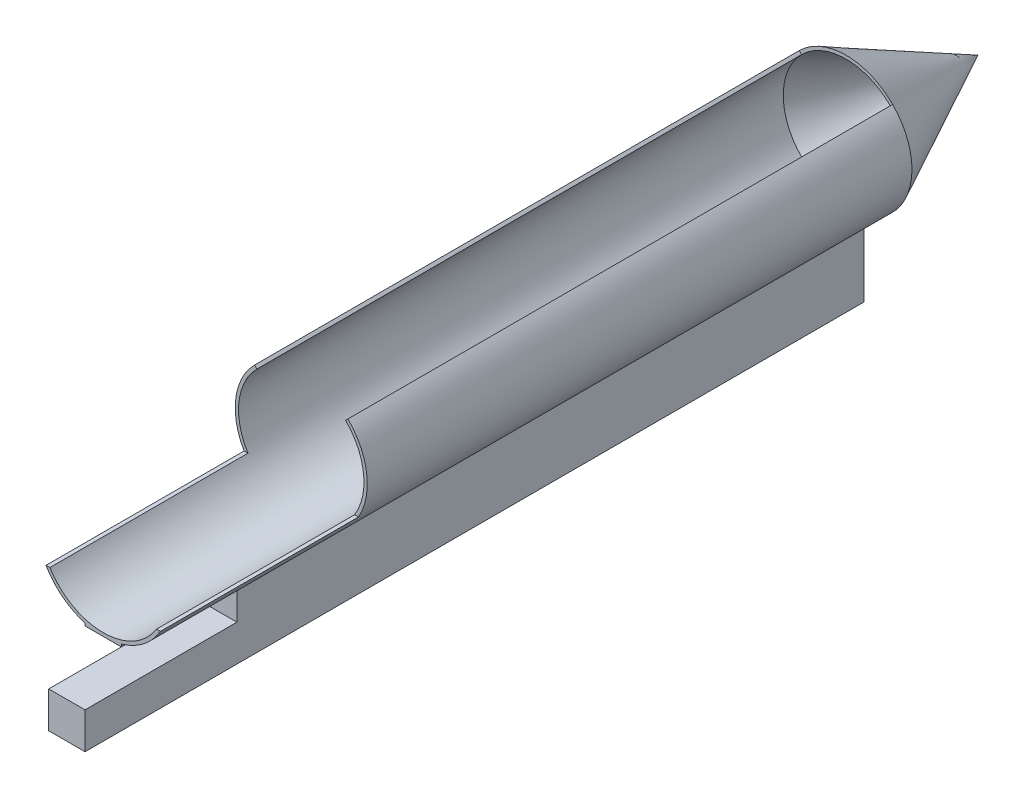
ISO-10303-21;
HEADER;
FILE_DESCRIPTION(('STEP AP214'),'2;1');
FILE_NAME('part.step','',(''),(''),'','','');
FILE_SCHEMA(('AUTOMOTIVE_DESIGN { 1 0 10303 214 1 1 1 1 }'));
ENDSEC;
DATA;
#1=APPLICATION_CONTEXT('core data for automotive mechanical design processes');
#2=APPLICATION_PROTOCOL_DEFINITION('international standard','automotive_design',2000,#1);
#3=PRODUCT_CONTEXT('',#1,'mechanical');
#4=PRODUCT('Part','Part','',(#3));
#5=PRODUCT_RELATED_PRODUCT_CATEGORY('part','',(#4));
#6=PRODUCT_DEFINITION_FORMATION('','',#4);
#7=PRODUCT_DEFINITION_CONTEXT('part definition',#1,'design');
#8=PRODUCT_DEFINITION('design','',#6,#7);
#9=PRODUCT_DEFINITION_SHAPE('','',#8);
#10=(LENGTH_UNIT() NAMED_UNIT(*) SI_UNIT(.MILLI.,.METRE.));
#11=(NAMED_UNIT(*) PLANE_ANGLE_UNIT() SI_UNIT($,.RADIAN.));
#12=(NAMED_UNIT(*) SI_UNIT($,.STERADIAN.) SOLID_ANGLE_UNIT());
#13=UNCERTAINTY_MEASURE_WITH_UNIT(LENGTH_MEASURE(1.E-05),#10,'distance_accuracy_value','');
#14=(GEOMETRIC_REPRESENTATION_CONTEXT(3) GLOBAL_UNCERTAINTY_ASSIGNED_CONTEXT((#13)) GLOBAL_UNIT_ASSIGNED_CONTEXT((#10,
#11,#12)) REPRESENTATION_CONTEXT('',''));
#15=CARTESIAN_POINT('',(0.,0.,0.));
#16=DIRECTION('',(0.,0.,1.));
#17=DIRECTION('',(1.,0.,0.));
#18=AXIS2_PLACEMENT_3D('',#15,#16,#17);
#19=CARTESIAN_POINT('',(0.,0.,0.));
#20=DIRECTION('',(0.,0.,1.));
#21=DIRECTION('',(1.,0.,0.));
#22=AXIS2_PLACEMENT_3D('',#19,#20,#21);
#23=PLANE('',#22);
#24=CARTESIAN_POINT('',(0.,0.,0.));
#25=DIRECTION('',(0.,0.,1.));
#26=DIRECTION('',(1.,0.,0.));
#27=AXIS2_PLACEMENT_3D('',#24,#25,#26);
#28=CIRCLE('',#27,40.);
#29=CARTESIAN_POINT('',(11.,-38.4577690460588,0.));
#30=VERTEX_POINT('',#29);
#31=CARTESIAN_POINT('',(-11.,-38.4577690460588,0.));
#32=VERTEX_POINT('',#31);
#33=EDGE_CURVE('E11',#30,#32,#28,.F.);
#34=ORIENTED_EDGE('',*,*,#33,.F.);
#35=DIRECTION('',(0.,1.,0.));
#36=VECTOR('',#35,1.);
#37=CARTESIAN_POINT('',(11.,-38.4577690460588,0.));
#38=LINE('',#37,#36);
#39=CARTESIAN_POINT('',(11.,-84.,0.));
#40=VERTEX_POINT('',#39);
#41=EDGE_CURVE('E269',#40,#30,#38,.T.);
#42=ORIENTED_EDGE('',*,*,#41,.F.);
#43=DIRECTION('',(1.,0.,0.));
#44=VECTOR('',#43,1.);
#45=CARTESIAN_POINT('',(-11.,-84.,0.));
#46=LINE('',#45,#44);
#47=CARTESIAN_POINT('',(-11.,-84.,0.));
#48=VERTEX_POINT('',#47);
#49=EDGE_CURVE('E288',#48,#40,#46,.T.);
#50=ORIENTED_EDGE('',*,*,#49,.F.);
#51=DIRECTION('',(0.,-1.,0.));
#52=VECTOR('',#51,1.);
#53=CARTESIAN_POINT('',(-11.,-38.4577690460588,0.));
#54=LINE('',#53,#52);
#55=EDGE_CURVE('E286',#32,#48,#54,.T.);
#56=ORIENTED_EDGE('',*,*,#55,.F.);
#57=EDGE_LOOP('',(#34,#42,#50,#56));
#58=FACE_BOUND('',#57,.T.);
#59=ADVANCED_FACE('F33',(#58),#23,.F.);
#60=CARTESIAN_POINT('',(0.,0.,472.));
#61=DIRECTION('',(0.,0.,-1.));
#62=DIRECTION('',(-1.,0.,0.));
#63=AXIS2_PLACEMENT_3D('',#60,#61,#62);
#64=CYLINDRICAL_SURFACE('',#63,40.);
#65=CARTESIAN_POINT('',(0.,0.,330.));
#66=DIRECTION('',(0.,0.,-1.));
#67=DIRECTION('',(-1.,0.,0.));
#68=AXIS2_PLACEMENT_3D('',#65,#66,#67);
#69=CIRCLE('',#68,40.);
#70=CARTESIAN_POINT('',(28.2842712474617,28.2842712474621,330.));
#71=VERTEX_POINT('',#70);
#72=CARTESIAN_POINT('',(34.6410161513775,-20.,330.));
#73=VERTEX_POINT('',#72);
#74=EDGE_CURVE('E326',#71,#73,#69,.T.);
#75=ORIENTED_EDGE('',*,*,#74,.T.);
#76=DIRECTION('',(0.,0.,-1.));
#77=VECTOR('',#76,1.);
#78=CARTESIAN_POINT('',(34.6410161513775,-20.,472.));
#79=LINE('',#78,#77);
#80=CARTESIAN_POINT('',(34.6410161513775,-20.,450.));
#81=VERTEX_POINT('',#80);
#82=EDGE_CURVE('E250',#73,#81,#79,.F.);
#83=ORIENTED_EDGE('',*,*,#82,.T.);
#84=CARTESIAN_POINT('',(0.,0.,450.));
#85=DIRECTION('',(0.,0.,1.));
#86=DIRECTION('',(1.,0.,0.));
#87=AXIS2_PLACEMENT_3D('',#84,#85,#86);
#88=CIRCLE('',#87,40.);
#89=CARTESIAN_POINT('',(11.,-38.4577690460588,450.));
#90=VERTEX_POINT('',#89);
#91=EDGE_CURVE('E255',#90,#81,#88,.T.);
#92=ORIENTED_EDGE('',*,*,#91,.F.);
#93=DIRECTION('',(0.,0.,-1.));
#94=VECTOR('',#93,1.);
#95=CARTESIAN_POINT('',(11.,-38.4577690460588,472.));
#96=LINE('',#95,#94);
#97=EDGE_CURVE('E274',#90,#30,#96,.T.);
#98=ORIENTED_EDGE('',*,*,#97,.T.);
#99=CARTESIAN_POINT('',(0.,0.,0.));
#100=DIRECTION('',(0.,0.,1.));
#101=DIRECTION('',(1.,0.,0.));
#102=AXIS2_PLACEMENT_3D('',#99,#100,#101);
#103=CIRCLE('',#102,40.);
#104=CARTESIAN_POINT('',(28.2842712474617,28.2842712474621,0.));
#105=VERTEX_POINT('',#104);
#106=EDGE_CURVE('E265',#30,#105,#103,.T.);
#107=ORIENTED_EDGE('',*,*,#106,.T.);
#108=DIRECTION('',(0.,0.,-1.));
#109=VECTOR('',#108,1.);
#110=CARTESIAN_POINT('',(28.2842712474617,28.2842712474621,472.));
#111=LINE('',#110,#109);
#112=EDGE_CURVE('E219',#71,#105,#111,.T.);
#113=ORIENTED_EDGE('',*,*,#112,.F.);
#114=EDGE_LOOP('',(#75,#83,#92,#98,#107,#113));
#115=FACE_BOUND('',#114,.T.);
#116=ADVANCED_FACE('F35',(#115),#64,.T.);
#117=CARTESIAN_POINT('',(26.8700576850887,26.870057685089,472.));
#118=DIRECTION('',(0.707106781186552,-0.707106781186543,0.));
#119=DIRECTION('',(0.707106781186543,0.707106781186552,0.));
#120=AXIS2_PLACEMENT_3D('',#117,#118,#119);
#121=PLANE('',#120);
#122=DIRECTION('',(0.,0.,-1.));
#123=VECTOR('',#122,1.);
#124=CARTESIAN_POINT('',(26.8700576850887,26.8700576850889,472.));
#125=LINE('',#124,#123);
#126=CARTESIAN_POINT('',(26.8700576850887,26.8700576850889,330.));
#127=VERTEX_POINT('',#126);
#128=CARTESIAN_POINT('',(26.8700576850887,26.8700576850889,0.));
#129=VERTEX_POINT('',#128);
#130=EDGE_CURVE('E212',#127,#129,#125,.T.);
#131=ORIENTED_EDGE('',*,*,#130,.F.);
#132=DIRECTION('',(0.707106781186543,0.707106781186552,0.));
#133=VECTOR('',#132,1.);
#134=CARTESIAN_POINT('',(26.8700576850887,26.870057685089,330.));
#135=LINE('',#134,#133);
#136=EDGE_CURVE('E214',#127,#71,#135,.T.);
#137=ORIENTED_EDGE('',*,*,#136,.T.);
#138=ORIENTED_EDGE('',*,*,#112,.T.);
#139=DIRECTION('',(-0.707106781186543,-0.707106781186552,0.));
#140=VECTOR('',#139,1.);
#141=CARTESIAN_POINT('',(26.8700576850887,26.870057685089,0.));
#142=LINE('',#141,#140);
#143=EDGE_CURVE('E216',#105,#129,#142,.T.);
#144=ORIENTED_EDGE('',*,*,#143,.T.);
#145=EDGE_LOOP('',(#131,#137,#138,#144));
#146=FACE_BOUND('',#145,.T.);
#147=ADVANCED_FACE('F174',(#146),#121,.F.);
#148=CARTESIAN_POINT('',(0.,0.,472.));
#149=DIRECTION('',(0.,0.,-1.));
#150=DIRECTION('',(-1.,0.,0.));
#151=AXIS2_PLACEMENT_3D('',#148,#149,#150);
#152=CYLINDRICAL_SURFACE('',#151,38.);
#153=CARTESIAN_POINT('',(0.,0.,450.));
#154=DIRECTION('',(0.,0.,1.));
#155=DIRECTION('',(1.,0.,0.));
#156=AXIS2_PLACEMENT_3D('',#153,#154,#155);
#157=CIRCLE('',#156,38.);
#158=CARTESIAN_POINT('',(32.310988842807,-20.,450.));
#159=VERTEX_POINT('',#158);
#160=CARTESIAN_POINT('',(-32.310988842807,-20.,450.));
#161=VERTEX_POINT('',#160);
#162=EDGE_CURVE('E247',#159,#161,#157,.F.);
#163=ORIENTED_EDGE('',*,*,#162,.F.);
#164=DIRECTION('',(0.,0.,-1.));
#165=VECTOR('',#164,1.);
#166=CARTESIAN_POINT('',(32.310988842807,-20.,472.));
#167=LINE('',#166,#165);
#168=CARTESIAN_POINT('',(32.310988842807,-20.,330.));
#169=VERTEX_POINT('',#168);
#170=EDGE_CURVE('E56',#159,#169,#167,.T.);
#171=ORIENTED_EDGE('',*,*,#170,.T.);
#172=CARTESIAN_POINT('',(0.,0.,330.));
#173=DIRECTION('',(0.,0.,-1.));
#174=DIRECTION('',(-1.,0.,0.));
#175=AXIS2_PLACEMENT_3D('',#172,#173,#174);
#176=CIRCLE('',#175,38.);
#177=EDGE_CURVE('E324',#169,#127,#176,.F.);
#178=ORIENTED_EDGE('',*,*,#177,.T.);
#179=ORIENTED_EDGE('',*,*,#130,.T.);
#180=CARTESIAN_POINT('',(0.,0.,0.));
#181=DIRECTION('',(0.,0.,-1.));
#182=DIRECTION('',(1.,0.,0.));
#183=AXIS2_PLACEMENT_3D('',#180,#181,#182);
#184=CIRCLE('',#183,38.);
#185=CARTESIAN_POINT('',(-26.8700576850891,26.8700576850886,0.));
#186=VERTEX_POINT('',#185);
#187=EDGE_CURVE('E278',#129,#186,#184,.T.);
#188=ORIENTED_EDGE('',*,*,#187,.T.);
#189=DIRECTION('',(0.,0.,-1.));
#190=VECTOR('',#189,1.);
#191=CARTESIAN_POINT('',(-26.8700576850891,26.8700576850886,472.));
#192=LINE('',#191,#190);
#193=CARTESIAN_POINT('',(-26.8700576850891,26.8700576850886,330.));
#194=VERTEX_POINT('',#193);
#195=EDGE_CURVE('E220',#194,#186,#192,.T.);
#196=ORIENTED_EDGE('',*,*,#195,.F.);
#197=CARTESIAN_POINT('',(-32.310988842807,-20.,330.));
#198=VERTEX_POINT('',#197);
#199=EDGE_CURVE('E249',#194,#198,#176,.F.);
#200=ORIENTED_EDGE('',*,*,#199,.T.);
#201=DIRECTION('',(0.,0.,-1.));
#202=VECTOR('',#201,1.);
#203=CARTESIAN_POINT('',(-32.310988842807,-20.,472.));
#204=LINE('',#203,#202);
#205=EDGE_CURVE('E240',#198,#161,#204,.F.);
#206=ORIENTED_EDGE('',*,*,#205,.T.);
#207=EDGE_LOOP('',(#163,#171,#178,#179,#188,#196,#200,#206));
#208=FACE_BOUND('',#207,.T.);
#209=ADVANCED_FACE('F200',(#208),#152,.F.);
#210=CARTESIAN_POINT('',(-28.2842712474622,28.2842712474616,472.));
#211=DIRECTION('',(-0.707106781186541,-0.707106781186553,0.));
#212=DIRECTION('',(0.707106781186554,-0.707106781186541,0.));
#213=AXIS2_PLACEMENT_3D('',#210,#211,#212);
#214=PLANE('',#213);
#215=DIRECTION('',(0.,0.,-1.));
#216=VECTOR('',#215,1.);
#217=CARTESIAN_POINT('',(-28.2842712474622,28.2842712474616,472.));
#218=LINE('',#217,#216);
#219=CARTESIAN_POINT('',(-28.2842712474622,28.2842712474616,330.));
#220=VERTEX_POINT('',#219);
#221=CARTESIAN_POINT('',(-28.2842712474622,28.2842712474616,0.));
#222=VERTEX_POINT('',#221);
#223=EDGE_CURVE('E225',#220,#222,#218,.T.);
#224=ORIENTED_EDGE('',*,*,#223,.F.);
#225=DIRECTION('',(0.707106781186554,-0.707106781186541,0.));
#226=VECTOR('',#225,1.);
#227=CARTESIAN_POINT('',(-28.2842712474622,28.2842712474616,330.));
#228=LINE('',#227,#226);
#229=EDGE_CURVE('E321',#220,#194,#228,.T.);
#230=ORIENTED_EDGE('',*,*,#229,.T.);
#231=ORIENTED_EDGE('',*,*,#195,.T.);
#232=DIRECTION('',(-0.707106781186554,0.707106781186542,0.));
#233=VECTOR('',#232,1.);
#234=CARTESIAN_POINT('',(-28.2842712474622,28.2842712474616,0.));
#235=LINE('',#234,#233);
#236=EDGE_CURVE('E280',#186,#222,#235,.T.);
#237=ORIENTED_EDGE('',*,*,#236,.T.);
#238=EDGE_LOOP('',(#224,#230,#231,#237));
#239=FACE_BOUND('',#238,.T.);
#240=ADVANCED_FACE('F196',(#239),#214,.F.);
#241=CARTESIAN_POINT('',(0.,0.,472.));
#242=DIRECTION('',(0.,0.,-1.));
#243=DIRECTION('',(-1.,0.,0.));
#244=AXIS2_PLACEMENT_3D('',#241,#242,#243);
#245=CYLINDRICAL_SURFACE('',#244,40.);
#246=CARTESIAN_POINT('',(0.,0.,450.));
#247=DIRECTION('',(0.,0.,1.));
#248=DIRECTION('',(1.,0.,0.));
#249=AXIS2_PLACEMENT_3D('',#246,#247,#248);
#250=CIRCLE('',#249,40.);
#251=CARTESIAN_POINT('',(-34.6410161513775,-20.,450.));
#252=VERTEX_POINT('',#251);
#253=CARTESIAN_POINT('',(-11.,-38.4577690460588,450.));
#254=VERTEX_POINT('',#253);
#255=EDGE_CURVE('E254',#252,#254,#250,.T.);
#256=ORIENTED_EDGE('',*,*,#255,.F.);
#257=DIRECTION('',(0.,0.,-1.));
#258=VECTOR('',#257,1.);
#259=CARTESIAN_POINT('',(-34.6410161513775,-20.,472.));
#260=LINE('',#259,#258);
#261=CARTESIAN_POINT('',(-34.6410161513775,-20.,330.));
#262=VERTEX_POINT('',#261);
#263=EDGE_CURVE('E48',#252,#262,#260,.T.);
#264=ORIENTED_EDGE('',*,*,#263,.T.);
#265=CARTESIAN_POINT('',(0.,0.,330.));
#266=DIRECTION('',(0.,0.,-1.));
#267=DIRECTION('',(-1.,0.,0.));
#268=AXIS2_PLACEMENT_3D('',#265,#266,#267);
#269=CIRCLE('',#268,40.);
#270=EDGE_CURVE('E41',#262,#220,#269,.T.);
#271=ORIENTED_EDGE('',*,*,#270,.T.);
#272=ORIENTED_EDGE('',*,*,#223,.T.);
#273=CARTESIAN_POINT('',(0.,0.,0.));
#274=DIRECTION('',(0.,0.,1.));
#275=DIRECTION('',(1.,0.,0.));
#276=AXIS2_PLACEMENT_3D('',#273,#274,#275);
#277=CIRCLE('',#276,40.);
#278=EDGE_CURVE('E283',#222,#32,#277,.T.);
#279=ORIENTED_EDGE('',*,*,#278,.T.);
#280=DIRECTION('',(0.,0.,-1.));
#281=VECTOR('',#280,1.);
#282=CARTESIAN_POINT('',(-11.,-38.4577690460588,472.));
#283=LINE('',#282,#281);
#284=EDGE_CURVE('E300',#254,#32,#283,.T.);
#285=ORIENTED_EDGE('',*,*,#284,.F.);
#286=EDGE_LOOP('',(#256,#264,#271,#272,#279,#285));
#287=FACE_BOUND('',#286,.T.);
#288=ADVANCED_FACE('F192',(#287),#245,.T.);
#289=CARTESIAN_POINT('',(-11.,-38.4577690460588,472.));
#290=DIRECTION('',(1.,0.,0.));
#291=DIRECTION('',(0.,1.,0.));
#292=AXIS2_PLACEMENT_3D('',#289,#290,#291);
#293=PLANE('',#292);
#294=DIRECTION('',(0.,-1.,0.));
#295=VECTOR('',#294,1.);
#296=CARTESIAN_POINT('',(-11.,-38.4577690460588,380.));
#297=LINE('',#296,#295);
#298=CARTESIAN_POINT('',(-11.,-40.,380.));
#299=VERTEX_POINT('',#298);
#300=CARTESIAN_POINT('',(-11.,-62.,380.));
#301=VERTEX_POINT('',#300);
#302=EDGE_CURVE('E343',#299,#301,#297,.T.);
#303=ORIENTED_EDGE('',*,*,#302,.F.);
#304=DIRECTION('',(0.,0.,1.));
#305=VECTOR('',#304,1.);
#306=CARTESIAN_POINT('',(-11.,-40.,472.));
#307=LINE('',#306,#305);
#308=CARTESIAN_POINT('',(-11.,-40.,450.));
#309=VERTEX_POINT('',#308);
#310=EDGE_CURVE('E340',#299,#309,#307,.T.);
#311=ORIENTED_EDGE('',*,*,#310,.T.);
#312=DIRECTION('',(0.,-1.,0.));
#313=VECTOR('',#312,1.);
#314=CARTESIAN_POINT('',(-11.,-38.4577690460588,450.));
#315=LINE('',#314,#313);
#316=EDGE_CURVE('E257',#254,#309,#315,.T.);
#317=ORIENTED_EDGE('',*,*,#316,.F.);
#318=ORIENTED_EDGE('',*,*,#284,.T.);
#319=ORIENTED_EDGE('',*,*,#55,.T.);
#320=DIRECTION('',(0.,0.,-1.));
#321=VECTOR('',#320,1.);
#322=CARTESIAN_POINT('',(-11.,-84.,472.));
#323=LINE('',#322,#321);
#324=CARTESIAN_POINT('',(-11.,-84.,472.));
#325=VERTEX_POINT('',#324);
#326=EDGE_CURVE('E297',#325,#48,#323,.T.);
#327=ORIENTED_EDGE('',*,*,#326,.F.);
#328=DIRECTION('',(0.,-1.,0.));
#329=VECTOR('',#328,1.);
#330=CARTESIAN_POINT('',(-11.,-38.4577690460588,472.));
#331=LINE('',#330,#329);
#332=CARTESIAN_POINT('',(-11.,-62.,472.));
#333=VERTEX_POINT('',#332);
#334=EDGE_CURVE('E266',#333,#325,#331,.T.);
#335=ORIENTED_EDGE('',*,*,#334,.F.);
#336=DIRECTION('',(0.,0.,-1.));
#337=VECTOR('',#336,1.);
#338=CARTESIAN_POINT('',(-11.,-62.,472.));
#339=LINE('',#338,#337);
#340=EDGE_CURVE('E259',#333,#301,#339,.T.);
#341=ORIENTED_EDGE('',*,*,#340,.T.);
#342=EDGE_LOOP('',(#303,#311,#317,#318,#319,#327,#335,#341));
#343=FACE_BOUND('',#342,.T.);
#344=ADVANCED_FACE('F188',(#343),#293,.F.);
#345=CARTESIAN_POINT('',(-11.,-84.,472.));
#346=DIRECTION('',(0.,1.,0.));
#347=DIRECTION('',(0.,0.,1.));
#348=AXIS2_PLACEMENT_3D('',#345,#346,#347);
#349=PLANE('',#348);
#350=ORIENTED_EDGE('',*,*,#49,.T.);
#351=DIRECTION('',(0.,0.,-1.));
#352=VECTOR('',#351,1.);
#353=CARTESIAN_POINT('',(11.,-84.,472.));
#354=LINE('',#353,#352);
#355=CARTESIAN_POINT('',(11.,-84.,472.));
#356=VERTEX_POINT('',#355);
#357=EDGE_CURVE('E294',#356,#40,#354,.T.);
#358=ORIENTED_EDGE('',*,*,#357,.F.);
#359=DIRECTION('',(1.,0.,0.));
#360=VECTOR('',#359,1.);
#361=CARTESIAN_POINT('',(-11.,-84.,472.));
#362=LINE('',#361,#360);
#363=EDGE_CURVE('E268',#325,#356,#362,.T.);
#364=ORIENTED_EDGE('',*,*,#363,.F.);
#365=ORIENTED_EDGE('',*,*,#326,.T.);
#366=EDGE_LOOP('',(#350,#358,#364,#365));
#367=FACE_BOUND('',#366,.T.);
#368=ADVANCED_FACE('F184',(#367),#349,.F.);
#369=CARTESIAN_POINT('',(11.,-38.4577690460588,472.));
#370=DIRECTION('',(-1.,0.,0.));
#371=DIRECTION('',(0.,-1.,0.));
#372=AXIS2_PLACEMENT_3D('',#369,#370,#371);
#373=PLANE('',#372);
#374=DIRECTION('',(0.,1.,0.));
#375=VECTOR('',#374,1.);
#376=CARTESIAN_POINT('',(11.,-38.4577690460588,450.));
#377=LINE('',#376,#375);
#378=CARTESIAN_POINT('',(11.,-40.,450.));
#379=VERTEX_POINT('',#378);
#380=EDGE_CURVE('E230',#379,#90,#377,.T.);
#381=ORIENTED_EDGE('',*,*,#380,.F.);
#382=DIRECTION('',(0.,0.,-1.));
#383=VECTOR('',#382,1.);
#384=CARTESIAN_POINT('',(11.,-40.,472.));
#385=LINE('',#384,#383);
#386=CARTESIAN_POINT('',(11.,-40.,380.));
#387=VERTEX_POINT('',#386);
#388=EDGE_CURVE('E336',#379,#387,#385,.T.);
#389=ORIENTED_EDGE('',*,*,#388,.T.);
#390=DIRECTION('',(0.,1.,0.));
#391=VECTOR('',#390,1.);
#392=CARTESIAN_POINT('',(11.,-38.4577690460588,380.));
#393=LINE('',#392,#391);
#394=CARTESIAN_POINT('',(11.,-62.,380.));
#395=VERTEX_POINT('',#394);
#396=EDGE_CURVE('E232',#395,#387,#393,.T.);
#397=ORIENTED_EDGE('',*,*,#396,.F.);
#398=DIRECTION('',(0.,0.,1.));
#399=VECTOR('',#398,1.);
#400=CARTESIAN_POINT('',(11.,-62.,472.));
#401=LINE('',#400,#399);
#402=CARTESIAN_POINT('',(11.,-62.,472.));
#403=VERTEX_POINT('',#402);
#404=EDGE_CURVE('E346',#395,#403,#401,.T.);
#405=ORIENTED_EDGE('',*,*,#404,.T.);
#406=DIRECTION('',(0.,1.,0.));
#407=VECTOR('',#406,1.);
#408=CARTESIAN_POINT('',(11.,-38.4577690460588,472.));
#409=LINE('',#408,#407);
#410=EDGE_CURVE('E271',#356,#403,#409,.T.);
#411=ORIENTED_EDGE('',*,*,#410,.F.);
#412=ORIENTED_EDGE('',*,*,#357,.T.);
#413=ORIENTED_EDGE('',*,*,#41,.T.);
#414=ORIENTED_EDGE('',*,*,#97,.F.);
#415=EDGE_LOOP('',(#381,#389,#397,#405,#411,#412,#413,#414));
#416=FACE_BOUND('',#415,.T.);
#417=ADVANCED_FACE('F181',(#416),#373,.F.);
#418=CARTESIAN_POINT('',(0.,0.,472.));
#419=DIRECTION('',(0.,0.,1.));
#420=DIRECTION('',(1.,0.,0.));
#421=AXIS2_PLACEMENT_3D('',#418,#419,#420);
#422=PLANE('',#421);
#423=DIRECTION('',(1.,0.,0.));
#424=VECTOR('',#423,1.);
#425=CARTESIAN_POINT('',(0.,-62.,472.));
#426=LINE('',#425,#424);
#427=EDGE_CURVE('E222',#333,#403,#426,.T.);
#428=ORIENTED_EDGE('',*,*,#427,.F.);
#429=ORIENTED_EDGE('',*,*,#334,.T.);
#430=ORIENTED_EDGE('',*,*,#363,.T.);
#431=ORIENTED_EDGE('',*,*,#410,.T.);
#432=EDGE_LOOP('',(#428,#429,#430,#431));
#433=FACE_BOUND('',#432,.T.);
#434=ADVANCED_FACE('F179',(#433),#422,.T.);
#435=CARTESIAN_POINT('',(0.,0.,450.));
#436=DIRECTION('',(0.,0.,1.));
#437=DIRECTION('',(1.,0.,0.));
#438=AXIS2_PLACEMENT_3D('',#435,#436,#437);
#439=PLANE('',#438);
#440=DIRECTION('',(1.,0.,0.));
#441=VECTOR('',#440,1.);
#442=CARTESIAN_POINT('',(0.,-20.,450.));
#443=LINE('',#442,#441);
#444=EDGE_CURVE('E235',#252,#161,#443,.T.);
#445=ORIENTED_EDGE('',*,*,#444,.F.);
#446=ORIENTED_EDGE('',*,*,#255,.T.);
#447=ORIENTED_EDGE('',*,*,#316,.T.);
#448=DIRECTION('',(-1.,0.,0.));
#449=VECTOR('',#448,1.);
#450=CARTESIAN_POINT('',(-25.,-40.,450.));
#451=LINE('',#450,#449);
#452=EDGE_CURVE('E329',#379,#309,#451,.T.);
#453=ORIENTED_EDGE('',*,*,#452,.F.);
#454=ORIENTED_EDGE('',*,*,#380,.T.);
#455=ORIENTED_EDGE('',*,*,#91,.T.);
#456=EDGE_CURVE('E234',#159,#81,#443,.T.);
#457=ORIENTED_EDGE('',*,*,#456,.F.);
#458=ORIENTED_EDGE('',*,*,#162,.T.);
#459=EDGE_LOOP('',(#445,#446,#447,#453,#454,#455,#457,#458));
#460=FACE_BOUND('',#459,.T.);
#461=ADVANCED_FACE('F252',(#460),#439,.T.);
#462=CARTESIAN_POINT('',(82.5,-62.,450.));
#463=DIRECTION('',(0.,-1.,0.));
#464=DIRECTION('',(0.,0.,-1.));
#465=AXIS2_PLACEMENT_3D('',#462,#463,#464);
#466=PLANE('',#465);
#467=ORIENTED_EDGE('',*,*,#427,.T.);
#468=ORIENTED_EDGE('',*,*,#404,.F.);
#469=DIRECTION('',(1.,0.,0.));
#470=VECTOR('',#469,1.);
#471=CARTESIAN_POINT('',(-25.,-62.,380.));
#472=LINE('',#471,#470);
#473=EDGE_CURVE('E330',#301,#395,#472,.T.);
#474=ORIENTED_EDGE('',*,*,#473,.F.);
#475=ORIENTED_EDGE('',*,*,#340,.F.);
#476=EDGE_LOOP('',(#467,#468,#474,#475));
#477=FACE_BOUND('',#476,.T.);
#478=ADVANCED_FACE('F358',(#477),#466,.F.);
#479=CARTESIAN_POINT('',(0.,0.,380.));
#480=DIRECTION('',(0.,0.,1.));
#481=DIRECTION('',(1.,0.,0.));
#482=AXIS2_PLACEMENT_3D('',#479,#480,#481);
#483=PLANE('',#482);
#484=ORIENTED_EDGE('',*,*,#302,.T.);
#485=ORIENTED_EDGE('',*,*,#473,.T.);
#486=ORIENTED_EDGE('',*,*,#396,.T.);
#487=DIRECTION('',(-1.,0.,0.));
#488=VECTOR('',#487,1.);
#489=CARTESIAN_POINT('',(-25.,-40.,380.));
#490=LINE('',#489,#488);
#491=EDGE_CURVE('E333',#387,#299,#490,.T.);
#492=ORIENTED_EDGE('',*,*,#491,.T.);
#493=EDGE_LOOP('',(#484,#485,#486,#492));
#494=FACE_BOUND('',#493,.T.);
#495=ADVANCED_FACE('F355',(#494),#483,.T.);
#496=CARTESIAN_POINT('',(-25.,-40.,380.));
#497=DIRECTION('',(0.,1.,0.));
#498=DIRECTION('',(0.,0.,1.));
#499=AXIS2_PLACEMENT_3D('',#496,#497,#498);
#500=PLANE('',#499);
#501=ORIENTED_EDGE('',*,*,#491,.F.);
#502=ORIENTED_EDGE('',*,*,#388,.F.);
#503=ORIENTED_EDGE('',*,*,#452,.T.);
#504=ORIENTED_EDGE('',*,*,#310,.F.);
#505=EDGE_LOOP('',(#501,#502,#503,#504));
#506=FACE_BOUND('',#505,.T.);
#507=ADVANCED_FACE('F371',(#506),#500,.F.);
#508=CARTESIAN_POINT('',(-67.5,-20.,330.));
#509=DIRECTION('',(0.,-1.,0.));
#510=DIRECTION('',(0.,0.,-1.));
#511=AXIS2_PLACEMENT_3D('',#508,#509,#510);
#512=PLANE('',#511);
#513=DIRECTION('',(1.,0.,0.));
#514=VECTOR('',#513,1.);
#515=CARTESIAN_POINT('',(-67.5,-20.,330.));
#516=LINE('',#515,#514);
#517=EDGE_CURVE('E310',#169,#73,#516,.T.);
#518=ORIENTED_EDGE('',*,*,#517,.F.);
#519=ORIENTED_EDGE('',*,*,#170,.F.);
#520=ORIENTED_EDGE('',*,*,#456,.T.);
#521=ORIENTED_EDGE('',*,*,#82,.F.);
#522=EDGE_LOOP('',(#518,#519,#520,#521));
#523=FACE_BOUND('',#522,.T.);
#524=ADVANCED_FACE('F373',(#523),#512,.F.);
#525=CARTESIAN_POINT('',(0.,0.,330.));
#526=DIRECTION('',(0.,0.,-1.));
#527=DIRECTION('',(-1.,0.,0.));
#528=AXIS2_PLACEMENT_3D('',#525,#526,#527);
#529=PLANE('',#528);
#530=ORIENTED_EDGE('',*,*,#136,.F.);
#531=ORIENTED_EDGE('',*,*,#177,.F.);
#532=ORIENTED_EDGE('',*,*,#517,.T.);
#533=ORIENTED_EDGE('',*,*,#74,.F.);
#534=EDGE_LOOP('',(#530,#531,#532,#533));
#535=FACE_BOUND('',#534,.T.);
#536=ADVANCED_FACE('F379',(#535),#529,.F.);
#537=ORIENTED_EDGE('',*,*,#229,.F.);
#538=ORIENTED_EDGE('',*,*,#270,.F.);
#539=EDGE_CURVE('E313',#262,#198,#516,.T.);
#540=ORIENTED_EDGE('',*,*,#539,.T.);
#541=ORIENTED_EDGE('',*,*,#199,.F.);
#542=EDGE_LOOP('',(#537,#538,#540,#541));
#543=FACE_BOUND('',#542,.T.);
#544=ADVANCED_FACE('F420',(#543),#529,.F.);
#545=ORIENTED_EDGE('',*,*,#539,.F.);
#546=ORIENTED_EDGE('',*,*,#263,.F.);
#547=ORIENTED_EDGE('',*,*,#444,.T.);
#548=ORIENTED_EDGE('',*,*,#205,.F.);
#549=EDGE_LOOP('',(#545,#546,#547,#548));
#550=FACE_BOUND('',#549,.T.);
#551=ADVANCED_FACE('F163',(#550),#512,.F.);
#552=CARTESIAN_POINT('',(-38.,0.,0.));
#553=DIRECTION('',(0.,0.,-1.));
#554=DIRECTION('',(-1.,0.,0.));
#555=AXIS2_PLACEMENT_3D('',#552,#553,#554);
#556=PLANE('',#555);
#557=CARTESIAN_POINT('',(0.,0.,0.));
#558=DIRECTION('',(0.,0.,1.));
#559=DIRECTION('',(1.,0.,0.));
#560=AXIS2_PLACEMENT_3D('',#557,#558,#559);
#561=CIRCLE('',#560,38.);
#562=EDGE_CURVE('E308',#129,#186,#561,.T.);
#563=ORIENTED_EDGE('',*,*,#562,.F.);
#564=ORIENTED_EDGE('',*,*,#143,.F.);
#565=CARTESIAN_POINT('',(0.,0.,0.));
#566=DIRECTION('',(0.,0.,1.));
#567=DIRECTION('',(1.,0.,0.));
#568=AXIS2_PLACEMENT_3D('',#565,#566,#567);
#569=CIRCLE('',#568,40.);
#570=EDGE_CURVE('E309',#105,#222,#569,.T.);
#571=ORIENTED_EDGE('',*,*,#570,.T.);
#572=ORIENTED_EDGE('',*,*,#236,.F.);
#573=EDGE_LOOP('',(#563,#564,#571,#572));
#574=FACE_BOUND('',#573,.T.);
#575=ADVANCED_FACE('F154',(#574),#556,.F.);
#576=CARTESIAN_POINT('',(0.,0.,-80.));
#577=DIRECTION('',(0.,0.,1.));
#578=DIRECTION('',(1.,0.,0.));
#579=AXIS2_PLACEMENT_3D('',#576,#577,#578);
#580=CONICAL_SURFACE('',#579,0.,0.463647609000806);
#581=ORIENTED_EDGE('',*,*,#570,.F.);
#582=ORIENTED_EDGE('',*,*,#106,.F.);
#583=ORIENTED_EDGE('',*,*,#33,.T.);
#584=ORIENTED_EDGE('',*,*,#278,.F.);
#585=EDGE_LOOP('',(#581,#582,#583,#584));
#586=FACE_BOUND('',#585,.T.);
#587=CARTESIAN_POINT('',(0.,0.,-80.));
#588=VERTEX_POINT('',#587);
#589=VERTEX_LOOP('',#588);
#590=FACE_BOUND('',#589,.T.);
#591=ADVANCED_FACE('F151',(#586,#590),#580,.T.);
#592=CARTESIAN_POINT('',(0.,0.,0.));
#593=DIRECTION('',(0.,0.,1.));
#594=DIRECTION('',(1.,0.,0.));
#595=AXIS2_PLACEMENT_3D('',#592,#593,#594);
#596=CONICAL_SURFACE('',#595,38.,0.463647609000806);
#597=CARTESIAN_POINT('',(0.,0.,-76.));
#598=VERTEX_POINT('',#597);
#599=VERTEX_LOOP('',#598);
#600=FACE_BOUND('',#599,.T.);
#601=ORIENTED_EDGE('',*,*,#562,.T.);
#602=ORIENTED_EDGE('',*,*,#187,.F.);
#603=EDGE_LOOP('',(#601,#602));
#604=FACE_BOUND('',#603,.T.);
#605=ADVANCED_FACE('F153',(#600,#604),#596,.F.);
#606=CLOSED_SHELL('',(#59,#116,#147,#209,#240,#288,#344,#368,#417,#434,#461,#478,#495,#507,#524,
#536,#544,#551,#575,#591,#605));
#607=MANIFOLD_SOLID_BREP('B2',#606);
#608=ADVANCED_BREP_SHAPE_REPRESENTATION('',(#18,#607),#14);
#609=SHAPE_DEFINITION_REPRESENTATION(#9,#608);
ENDSEC;
END-ISO-10303-21;
